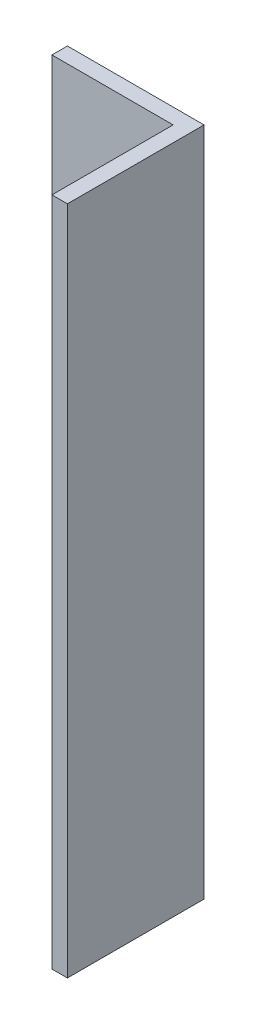
ISO-10303-21;
HEADER;
FILE_DESCRIPTION(('STEP AP214'),'2;1');
FILE_NAME('part.step','',(''),(''),'','','');
FILE_SCHEMA(('AUTOMOTIVE_DESIGN { 1 0 10303 214 1 1 1 1 }'));
ENDSEC;
DATA;
#1=APPLICATION_CONTEXT('core data for automotive mechanical design processes');
#2=APPLICATION_PROTOCOL_DEFINITION('international standard','automotive_design',2000,#1);
#3=PRODUCT_CONTEXT('',#1,'mechanical');
#4=PRODUCT('Part','Part','',(#3));
#5=PRODUCT_RELATED_PRODUCT_CATEGORY('part','',(#4));
#6=PRODUCT_DEFINITION_FORMATION('','',#4);
#7=PRODUCT_DEFINITION_CONTEXT('part definition',#1,'design');
#8=PRODUCT_DEFINITION('design','',#6,#7);
#9=PRODUCT_DEFINITION_SHAPE('','',#8);
#10=(LENGTH_UNIT() NAMED_UNIT(*) SI_UNIT(.MILLI.,.METRE.));
#11=(NAMED_UNIT(*) PLANE_ANGLE_UNIT() SI_UNIT($,.RADIAN.));
#12=(NAMED_UNIT(*) SI_UNIT($,.STERADIAN.) SOLID_ANGLE_UNIT());
#13=UNCERTAINTY_MEASURE_WITH_UNIT(LENGTH_MEASURE(1.E-05),#10,'distance_accuracy_value','');
#14=(GEOMETRIC_REPRESENTATION_CONTEXT(3) GLOBAL_UNCERTAINTY_ASSIGNED_CONTEXT((#13)) GLOBAL_UNIT_ASSIGNED_CONTEXT((#10,
#11,#12)) REPRESENTATION_CONTEXT('',''));
#15=CARTESIAN_POINT('',(0.,0.,0.));
#16=DIRECTION('',(0.,0.,1.));
#17=DIRECTION('',(1.,0.,0.));
#18=AXIS2_PLACEMENT_3D('',#15,#16,#17);
#19=CARTESIAN_POINT('',(0.,130.,3.));
#20=DIRECTION('',(1.,0.,0.));
#21=DIRECTION('',(0.,0.,-1.));
#22=AXIS2_PLACEMENT_3D('',#19,#20,#21);
#23=PLANE('',#22);
#24=DIRECTION('',(0.,0.,1.));
#25=VECTOR('',#24,1.);
#26=CARTESIAN_POINT('',(0.,0.,3.));
#27=LINE('',#26,#25);
#28=CARTESIAN_POINT('',(0.,0.,0.));
#29=VERTEX_POINT('',#28);
#30=CARTESIAN_POINT('',(0.,0.,3.));
#31=VERTEX_POINT('',#30);
#32=EDGE_CURVE('E130',#29,#31,#27,.T.);
#33=ORIENTED_EDGE('',*,*,#32,.T.);
#34=DIRECTION('',(0.,-1.,0.));
#35=VECTOR('',#34,1.);
#36=CARTESIAN_POINT('',(0.,130.,3.));
#37=LINE('',#36,#35);
#38=CARTESIAN_POINT('',(0.,130.,3.));
#39=VERTEX_POINT('',#38);
#40=EDGE_CURVE('E11',#39,#31,#37,.T.);
#41=ORIENTED_EDGE('',*,*,#40,.F.);
#42=DIRECTION('',(0.,0.,1.));
#43=VECTOR('',#42,1.);
#44=CARTESIAN_POINT('',(0.,130.,3.));
#45=LINE('',#44,#43);
#46=CARTESIAN_POINT('',(0.,130.,0.));
#47=VERTEX_POINT('',#46);
#48=EDGE_CURVE('E146',#47,#39,#45,.T.);
#49=ORIENTED_EDGE('',*,*,#48,.F.);
#50=DIRECTION('',(0.,-1.,0.));
#51=VECTOR('',#50,1.);
#52=CARTESIAN_POINT('',(0.,130.,0.));
#53=LINE('',#52,#51);
#54=EDGE_CURVE('E126',#47,#29,#53,.T.);
#55=ORIENTED_EDGE('',*,*,#54,.T.);
#56=EDGE_LOOP('',(#33,#41,#49,#55));
#57=FACE_BOUND('',#56,.T.);
#58=ADVANCED_FACE('F41',(#57),#23,.F.);
#59=CARTESIAN_POINT('',(23.5,130.,3.));
#60=DIRECTION('',(0.,0.,-1.));
#61=DIRECTION('',(-1.,0.,0.));
#62=AXIS2_PLACEMENT_3D('',#59,#60,#61);
#63=PLANE('',#62);
#64=DIRECTION('',(1.,0.,0.));
#65=VECTOR('',#64,1.);
#66=CARTESIAN_POINT('',(23.5,0.,3.));
#67=LINE('',#66,#65);
#68=CARTESIAN_POINT('',(23.5,0.,3.));
#69=VERTEX_POINT('',#68);
#70=EDGE_CURVE('E134',#31,#69,#67,.T.);
#71=ORIENTED_EDGE('',*,*,#70,.T.);
#72=DIRECTION('',(0.,-1.,0.));
#73=VECTOR('',#72,1.);
#74=CARTESIAN_POINT('',(23.5,130.,3.));
#75=LINE('',#74,#73);
#76=CARTESIAN_POINT('',(23.5,130.,3.));
#77=VERTEX_POINT('',#76);
#78=EDGE_CURVE('E50',#77,#69,#75,.T.);
#79=ORIENTED_EDGE('',*,*,#78,.F.);
#80=DIRECTION('',(1.,0.,0.));
#81=VECTOR('',#80,1.);
#82=CARTESIAN_POINT('',(23.5,130.,3.));
#83=LINE('',#82,#81);
#84=EDGE_CURVE('E95',#39,#77,#83,.T.);
#85=ORIENTED_EDGE('',*,*,#84,.F.);
#86=ORIENTED_EDGE('',*,*,#40,.T.);
#87=EDGE_LOOP('',(#71,#79,#85,#86));
#88=FACE_BOUND('',#87,.T.);
#89=ADVANCED_FACE('F174',(#88),#63,.F.);
#90=CARTESIAN_POINT('',(23.5,130.,26.5));
#91=DIRECTION('',(1.,0.,0.));
#92=DIRECTION('',(0.,0.,-1.));
#93=AXIS2_PLACEMENT_3D('',#90,#91,#92);
#94=PLANE('',#93);
#95=DIRECTION('',(0.,0.,1.));
#96=VECTOR('',#95,1.);
#97=CARTESIAN_POINT('',(23.5,0.,26.5));
#98=LINE('',#97,#96);
#99=CARTESIAN_POINT('',(23.5,0.,26.5));
#100=VERTEX_POINT('',#99);
#101=EDGE_CURVE('E137',#69,#100,#98,.T.);
#102=ORIENTED_EDGE('',*,*,#101,.T.);
#103=DIRECTION('',(0.,-1.,0.));
#104=VECTOR('',#103,1.);
#105=CARTESIAN_POINT('',(23.5,130.,26.5));
#106=LINE('',#105,#104);
#107=CARTESIAN_POINT('',(23.5,130.,26.5));
#108=VERTEX_POINT('',#107);
#109=EDGE_CURVE('E119',#108,#100,#106,.T.);
#110=ORIENTED_EDGE('',*,*,#109,.F.);
#111=DIRECTION('',(0.,0.,1.));
#112=VECTOR('',#111,1.);
#113=CARTESIAN_POINT('',(23.5,130.,26.5));
#114=LINE('',#113,#112);
#115=EDGE_CURVE('E108',#77,#108,#114,.T.);
#116=ORIENTED_EDGE('',*,*,#115,.F.);
#117=ORIENTED_EDGE('',*,*,#78,.T.);
#118=EDGE_LOOP('',(#102,#110,#116,#117));
#119=FACE_BOUND('',#118,.T.);
#120=ADVANCED_FACE('F156',(#119),#94,.F.);
#121=CARTESIAN_POINT('',(26.5,130.,26.5));
#122=DIRECTION('',(0.,0.,-1.));
#123=DIRECTION('',(-1.,0.,0.));
#124=AXIS2_PLACEMENT_3D('',#121,#122,#123);
#125=PLANE('',#124);
#126=DIRECTION('',(1.,0.,0.));
#127=VECTOR('',#126,1.);
#128=CARTESIAN_POINT('',(26.5,0.,26.5));
#129=LINE('',#128,#127);
#130=CARTESIAN_POINT('',(26.5,0.,26.5));
#131=VERTEX_POINT('',#130);
#132=EDGE_CURVE('E117',#100,#131,#129,.T.);
#133=ORIENTED_EDGE('',*,*,#132,.T.);
#134=DIRECTION('',(0.,-1.,0.));
#135=VECTOR('',#134,1.);
#136=CARTESIAN_POINT('',(26.5,130.,26.5));
#137=LINE('',#136,#135);
#138=CARTESIAN_POINT('',(26.5,130.,26.5));
#139=VERTEX_POINT('',#138);
#140=EDGE_CURVE('E114',#139,#131,#137,.T.);
#141=ORIENTED_EDGE('',*,*,#140,.F.);
#142=DIRECTION('',(1.,0.,0.));
#143=VECTOR('',#142,1.);
#144=CARTESIAN_POINT('',(26.5,130.,26.5));
#145=LINE('',#144,#143);
#146=EDGE_CURVE('E102',#108,#139,#145,.T.);
#147=ORIENTED_EDGE('',*,*,#146,.F.);
#148=ORIENTED_EDGE('',*,*,#109,.T.);
#149=EDGE_LOOP('',(#133,#141,#147,#148));
#150=FACE_BOUND('',#149,.T.);
#151=ADVANCED_FACE('F115',(#150),#125,.F.);
#152=CARTESIAN_POINT('',(26.5,130.,0.));
#153=DIRECTION('',(-1.,0.,0.));
#154=DIRECTION('',(0.,0.,1.));
#155=AXIS2_PLACEMENT_3D('',#152,#153,#154);
#156=PLANE('',#155);
#157=DIRECTION('',(0.,0.,-1.));
#158=VECTOR('',#157,1.);
#159=CARTESIAN_POINT('',(26.5,0.,0.));
#160=LINE('',#159,#158);
#161=CARTESIAN_POINT('',(26.5,0.,0.));
#162=VERTEX_POINT('',#161);
#163=EDGE_CURVE('E81',#131,#162,#160,.T.);
#164=ORIENTED_EDGE('',*,*,#163,.T.);
#165=DIRECTION('',(0.,-1.,0.));
#166=VECTOR('',#165,1.);
#167=CARTESIAN_POINT('',(26.5,130.,0.));
#168=LINE('',#167,#166);
#169=CARTESIAN_POINT('',(26.5,130.,0.));
#170=VERTEX_POINT('',#169);
#171=EDGE_CURVE('E120',#170,#162,#168,.T.);
#172=ORIENTED_EDGE('',*,*,#171,.F.);
#173=DIRECTION('',(0.,0.,-1.));
#174=VECTOR('',#173,1.);
#175=CARTESIAN_POINT('',(26.5,130.,0.));
#176=LINE('',#175,#174);
#177=EDGE_CURVE('E106',#139,#170,#176,.T.);
#178=ORIENTED_EDGE('',*,*,#177,.F.);
#179=ORIENTED_EDGE('',*,*,#140,.T.);
#180=EDGE_LOOP('',(#164,#172,#178,#179));
#181=FACE_BOUND('',#180,.T.);
#182=ADVANCED_FACE('F122',(#181),#156,.F.);
#183=CARTESIAN_POINT('',(0.,130.,0.));
#184=DIRECTION('',(0.,0.,1.));
#185=DIRECTION('',(1.,0.,0.));
#186=AXIS2_PLACEMENT_3D('',#183,#184,#185);
#187=PLANE('',#186);
#188=DIRECTION('',(-1.,0.,0.));
#189=VECTOR('',#188,1.);
#190=CARTESIAN_POINT('',(0.,0.,0.));
#191=LINE('',#190,#189);
#192=EDGE_CURVE('E87',#162,#29,#191,.T.);
#193=ORIENTED_EDGE('',*,*,#192,.T.);
#194=ORIENTED_EDGE('',*,*,#54,.F.);
#195=DIRECTION('',(-1.,0.,0.));
#196=VECTOR('',#195,1.);
#197=CARTESIAN_POINT('',(0.,130.,0.));
#198=LINE('',#197,#196);
#199=EDGE_CURVE('E58',#170,#47,#198,.T.);
#200=ORIENTED_EDGE('',*,*,#199,.F.);
#201=ORIENTED_EDGE('',*,*,#171,.T.);
#202=EDGE_LOOP('',(#193,#194,#200,#201));
#203=FACE_BOUND('',#202,.T.);
#204=ADVANCED_FACE('F163',(#203),#187,.F.);
#205=CARTESIAN_POINT('',(0.,130.,0.));
#206=DIRECTION('',(0.,-1.,0.));
#207=DIRECTION('',(0.,0.,-1.));
#208=AXIS2_PLACEMENT_3D('',#205,#206,#207);
#209=PLANE('',#208);
#210=ORIENTED_EDGE('',*,*,#48,.T.);
#211=ORIENTED_EDGE('',*,*,#84,.T.);
#212=ORIENTED_EDGE('',*,*,#115,.T.);
#213=ORIENTED_EDGE('',*,*,#146,.T.);
#214=ORIENTED_EDGE('',*,*,#177,.T.);
#215=ORIENTED_EDGE('',*,*,#199,.T.);
#216=EDGE_LOOP('',(#210,#211,#212,#213,#214,#215));
#217=FACE_BOUND('',#216,.T.);
#218=ADVANCED_FACE('F104',(#217),#209,.F.);
#219=CARTESIAN_POINT('',(0.,0.,0.));
#220=DIRECTION('',(0.,-1.,0.));
#221=DIRECTION('',(0.,0.,-1.));
#222=AXIS2_PLACEMENT_3D('',#219,#220,#221);
#223=PLANE('',#222);
#224=ORIENTED_EDGE('',*,*,#32,.F.);
#225=ORIENTED_EDGE('',*,*,#192,.F.);
#226=ORIENTED_EDGE('',*,*,#163,.F.);
#227=ORIENTED_EDGE('',*,*,#132,.F.);
#228=ORIENTED_EDGE('',*,*,#101,.F.);
#229=ORIENTED_EDGE('',*,*,#70,.F.);
#230=EDGE_LOOP('',(#224,#225,#226,#227,#228,#229));
#231=FACE_BOUND('',#230,.T.);
#232=ADVANCED_FACE('F159',(#231),#223,.T.);
#233=CLOSED_SHELL('',(#58,#89,#120,#151,#182,#204,#218,#232));
#234=MANIFOLD_SOLID_BREP('B2',#233);
#235=ADVANCED_BREP_SHAPE_REPRESENTATION('',(#18,#234),#14);
#236=SHAPE_DEFINITION_REPRESENTATION(#9,#235);
ENDSEC;
END-ISO-10303-21;
